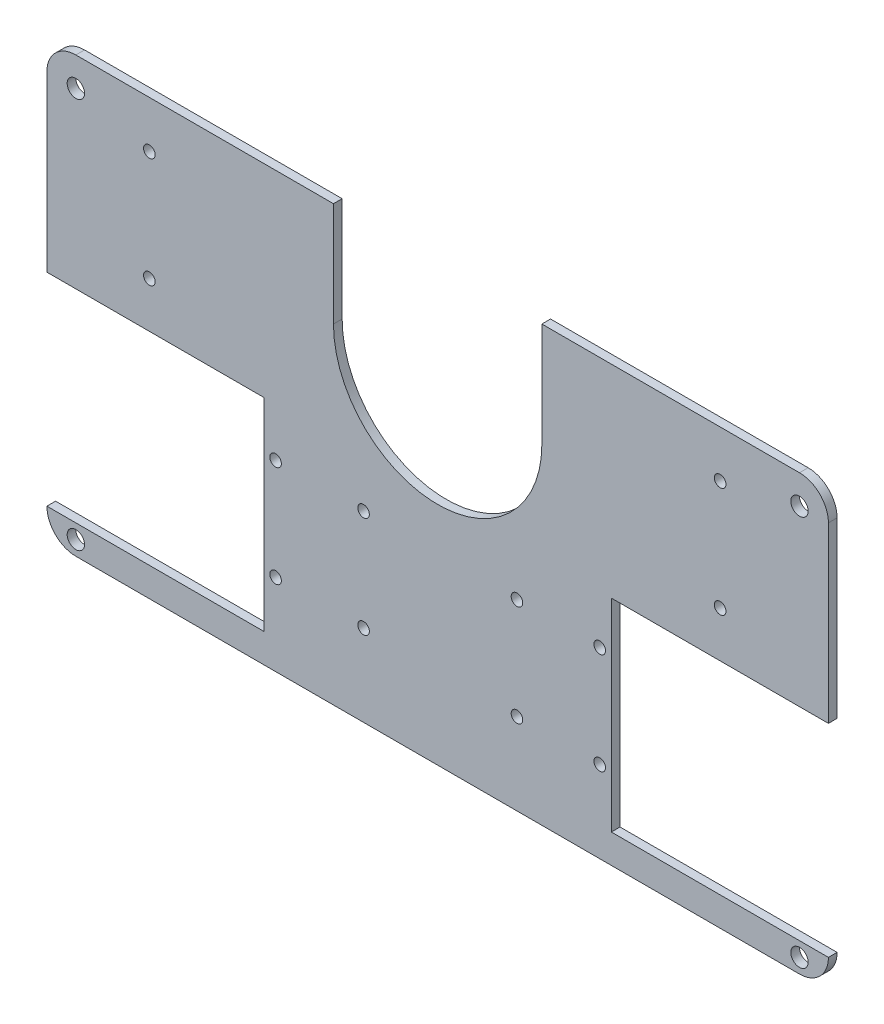
ISO-10303-21;
HEADER;
FILE_DESCRIPTION(('STEP AP214'),'2;1');
FILE_NAME('part.step','',(''),(''),'','','');
FILE_SCHEMA(('AUTOMOTIVE_DESIGN { 1 0 10303 214 1 1 1 1 }'));
ENDSEC;
DATA;
#1=APPLICATION_CONTEXT('core data for automotive mechanical design processes');
#2=APPLICATION_PROTOCOL_DEFINITION('international standard','automotive_design',2000,#1);
#3=PRODUCT_CONTEXT('',#1,'mechanical');
#4=PRODUCT('Part','Part','',(#3));
#5=PRODUCT_RELATED_PRODUCT_CATEGORY('part','',(#4));
#6=PRODUCT_DEFINITION_FORMATION('','',#4);
#7=PRODUCT_DEFINITION_CONTEXT('part definition',#1,'design');
#8=PRODUCT_DEFINITION('design','',#6,#7);
#9=PRODUCT_DEFINITION_SHAPE('','',#8);
#10=(LENGTH_UNIT() NAMED_UNIT(*) SI_UNIT(.MILLI.,.METRE.));
#11=(NAMED_UNIT(*) PLANE_ANGLE_UNIT() SI_UNIT($,.RADIAN.));
#12=(NAMED_UNIT(*) SI_UNIT($,.STERADIAN.) SOLID_ANGLE_UNIT());
#13=UNCERTAINTY_MEASURE_WITH_UNIT(LENGTH_MEASURE(1.E-05),#10,'distance_accuracy_value','');
#14=(GEOMETRIC_REPRESENTATION_CONTEXT(3) GLOBAL_UNCERTAINTY_ASSIGNED_CONTEXT((#13)) GLOBAL_UNIT_ASSIGNED_CONTEXT((#10,
#11,#12)) REPRESENTATION_CONTEXT('',''));
#15=CARTESIAN_POINT('',(0.,0.,0.));
#16=DIRECTION('',(0.,0.,1.));
#17=DIRECTION('',(1.,0.,0.));
#18=AXIS2_PLACEMENT_3D('',#15,#16,#17);
#19=CARTESIAN_POINT('',(260.,-10.,3.));
#20=DIRECTION('',(0.,0.,1.));
#21=DIRECTION('',(1.,0.,0.));
#22=AXIS2_PLACEMENT_3D('',#19,#20,#21);
#23=PLANE('',#22);
#24=CARTESIAN_POINT('',(10.,-145.,3.));
#25=DIRECTION('',(0.,0.,1.));
#26=DIRECTION('',(1.,0.,0.));
#27=AXIS2_PLACEMENT_3D('',#24,#25,#26);
#28=CIRCLE('',#27,3.);
#29=CARTESIAN_POINT('',(13.,-145.,3.));
#30=VERTEX_POINT('',#29);
#31=EDGE_CURVE('E711',#30,#30,#28,.T.);
#32=ORIENTED_EDGE('',*,*,#31,.F.);
#33=EDGE_LOOP('',(#32));
#34=FACE_BOUND('',#33,.T.);
#35=CARTESIAN_POINT('',(260.,-145.,3.));
#36=DIRECTION('',(0.,0.,1.));
#37=DIRECTION('',(1.,0.,0.));
#38=AXIS2_PLACEMENT_3D('',#35,#36,#37);
#39=CIRCLE('',#38,2.99999999999999);
#40=CARTESIAN_POINT('',(263.,-145.,3.));
#41=VERTEX_POINT('',#40);
#42=EDGE_CURVE('E712',#41,#41,#39,.T.);
#43=ORIENTED_EDGE('',*,*,#42,.F.);
#44=EDGE_LOOP('',(#43));
#45=FACE_BOUND('',#44,.T.);
#46=CARTESIAN_POINT('',(260.,-10.,3.));
#47=DIRECTION('',(0.,0.,1.));
#48=DIRECTION('',(1.,0.,0.));
#49=AXIS2_PLACEMENT_3D('',#46,#47,#48);
#50=CIRCLE('',#49,2.99999999999999);
#51=CARTESIAN_POINT('',(263.,-10.,3.));
#52=VERTEX_POINT('',#51);
#53=EDGE_CURVE('E714',#52,#52,#50,.T.);
#54=ORIENTED_EDGE('',*,*,#53,.F.);
#55=EDGE_LOOP('',(#54));
#56=FACE_BOUND('',#55,.T.);
#57=CARTESIAN_POINT('',(10.,-10.,3.));
#58=DIRECTION('',(0.,0.,1.));
#59=DIRECTION('',(1.,0.,0.));
#60=AXIS2_PLACEMENT_3D('',#57,#58,#59);
#61=CIRCLE('',#60,3.);
#62=CARTESIAN_POINT('',(13.,-10.,3.));
#63=VERTEX_POINT('',#62);
#64=EDGE_CURVE('E222',#63,#63,#61,.T.);
#65=ORIENTED_EDGE('',*,*,#64,.F.);
#66=EDGE_LOOP('',(#65));
#67=FACE_BOUND('',#66,.T.);
#68=DIRECTION('',(-1.,0.,0.));
#69=VECTOR('',#68,1.);
#70=CARTESIAN_POINT('',(0.,-70.,3.));
#71=LINE('',#70,#69);
#72=CARTESIAN_POINT('',(75.,-70.,3.));
#73=VERTEX_POINT('',#72);
#74=CARTESIAN_POINT('',(0.,-70.,3.));
#75=VERTEX_POINT('',#74);
#76=EDGE_CURVE('E342',#73,#75,#71,.T.);
#77=ORIENTED_EDGE('',*,*,#76,.F.);
#78=DIRECTION('',(0.,1.,0.));
#79=VECTOR('',#78,1.);
#80=CARTESIAN_POINT('',(75.,-140.,3.));
#81=LINE('',#80,#79);
#82=CARTESIAN_POINT('',(75.,-140.,3.));
#83=VERTEX_POINT('',#82);
#84=EDGE_CURVE('E414',#83,#73,#81,.T.);
#85=ORIENTED_EDGE('',*,*,#84,.F.);
#86=DIRECTION('',(1.,0.,0.));
#87=VECTOR('',#86,1.);
#88=CARTESIAN_POINT('',(0.,-140.,3.));
#89=LINE('',#88,#87);
#90=CARTESIAN_POINT('',(0.,-140.,3.));
#91=VERTEX_POINT('',#90);
#92=EDGE_CURVE('E143',#91,#83,#89,.T.);
#93=ORIENTED_EDGE('',*,*,#92,.F.);
#94=CARTESIAN_POINT('',(10.,-140.,3.));
#95=DIRECTION('',(0.,0.,1.));
#96=DIRECTION('',(1.,0.,0.));
#97=AXIS2_PLACEMENT_3D('',#94,#95,#96);
#98=CIRCLE('',#97,10.);
#99=CARTESIAN_POINT('',(10.0000000000001,-150.,3.));
#100=VERTEX_POINT('',#99);
#101=EDGE_CURVE('E132',#91,#100,#98,.T.);
#102=ORIENTED_EDGE('',*,*,#101,.T.);
#103=DIRECTION('',(1.,0.,0.));
#104=VECTOR('',#103,1.);
#105=CARTESIAN_POINT('',(10.0000000000001,-150.,3.));
#106=LINE('',#105,#104);
#107=CARTESIAN_POINT('',(260.,-150.,3.));
#108=VERTEX_POINT('',#107);
#109=EDGE_CURVE('E138',#100,#108,#106,.T.);
#110=ORIENTED_EDGE('',*,*,#109,.T.);
#111=CARTESIAN_POINT('',(260.,-140.,3.));
#112=DIRECTION('',(0.,0.,1.));
#113=DIRECTION('',(-1.,0.,0.));
#114=AXIS2_PLACEMENT_3D('',#111,#112,#113);
#115=CIRCLE('',#114,10.);
#116=CARTESIAN_POINT('',(270.,-140.,3.));
#117=VERTEX_POINT('',#116);
#118=EDGE_CURVE('E161',#108,#117,#115,.T.);
#119=ORIENTED_EDGE('',*,*,#118,.T.);
#120=DIRECTION('',(1.,0.,0.));
#121=VECTOR('',#120,1.);
#122=CARTESIAN_POINT('',(270.,-140.,3.));
#123=LINE('',#122,#121);
#124=CARTESIAN_POINT('',(195.,-140.,3.));
#125=VERTEX_POINT('',#124);
#126=EDGE_CURVE('E238',#125,#117,#123,.T.);
#127=ORIENTED_EDGE('',*,*,#126,.F.);
#128=DIRECTION('',(0.,-1.,0.));
#129=VECTOR('',#128,1.);
#130=CARTESIAN_POINT('',(195.,-140.,3.));
#131=LINE('',#130,#129);
#132=CARTESIAN_POINT('',(195.,-70.,3.));
#133=VERTEX_POINT('',#132);
#134=EDGE_CURVE('E233',#133,#125,#131,.T.);
#135=ORIENTED_EDGE('',*,*,#134,.F.);
#136=DIRECTION('',(-1.,0.,0.));
#137=VECTOR('',#136,1.);
#138=CARTESIAN_POINT('',(270.,-70.,3.));
#139=LINE('',#138,#137);
#140=CARTESIAN_POINT('',(270.,-70.,3.));
#141=VERTEX_POINT('',#140);
#142=EDGE_CURVE('E229',#141,#133,#139,.T.);
#143=ORIENTED_EDGE('',*,*,#142,.F.);
#144=DIRECTION('',(0.,1.,0.));
#145=VECTOR('',#144,1.);
#146=CARTESIAN_POINT('',(270.,-10.,3.));
#147=LINE('',#146,#145);
#148=CARTESIAN_POINT('',(270.,-10.,3.));
#149=VERTEX_POINT('',#148);
#150=EDGE_CURVE('E59',#141,#149,#147,.T.);
#151=ORIENTED_EDGE('',*,*,#150,.T.);
#152=CARTESIAN_POINT('',(260.,-10.,3.));
#153=DIRECTION('',(0.,0.,1.));
#154=DIRECTION('',(1.,0.,0.));
#155=AXIS2_PLACEMENT_3D('',#152,#153,#154);
#156=CIRCLE('',#155,10.);
#157=CARTESIAN_POINT('',(260.,0.,3.));
#158=VERTEX_POINT('',#157);
#159=EDGE_CURVE('E194',#149,#158,#156,.T.);
#160=ORIENTED_EDGE('',*,*,#159,.T.);
#161=DIRECTION('',(-1.,0.,0.));
#162=VECTOR('',#161,1.);
#163=CARTESIAN_POINT('',(171.,0.,3.));
#164=LINE('',#163,#162);
#165=CARTESIAN_POINT('',(171.,0.,3.));
#166=VERTEX_POINT('',#165);
#167=EDGE_CURVE('E109',#158,#166,#164,.T.);
#168=ORIENTED_EDGE('',*,*,#167,.T.);
#169=DIRECTION('',(0.,-1.,0.));
#170=VECTOR('',#169,1.);
#171=CARTESIAN_POINT('',(171.,-36.,3.));
#172=LINE('',#171,#170);
#173=CARTESIAN_POINT('',(171.,-36.,3.));
#174=VERTEX_POINT('',#173);
#175=EDGE_CURVE('E328',#166,#174,#172,.T.);
#176=ORIENTED_EDGE('',*,*,#175,.T.);
#177=CARTESIAN_POINT('',(135.,-36.,3.));
#178=DIRECTION('',(0.,0.,-1.));
#179=DIRECTION('',(1.,0.,0.));
#180=AXIS2_PLACEMENT_3D('',#177,#178,#179);
#181=CIRCLE('',#180,36.);
#182=CARTESIAN_POINT('',(99.,-36.,3.));
#183=VERTEX_POINT('',#182);
#184=EDGE_CURVE('E330',#174,#183,#181,.T.);
#185=ORIENTED_EDGE('',*,*,#184,.T.);
#186=DIRECTION('',(0.,1.,0.));
#187=VECTOR('',#186,1.);
#188=CARTESIAN_POINT('',(99.,0.,3.));
#189=LINE('',#188,#187);
#190=CARTESIAN_POINT('',(99.,0.,3.));
#191=VERTEX_POINT('',#190);
#192=EDGE_CURVE('E332',#183,#191,#189,.T.);
#193=ORIENTED_EDGE('',*,*,#192,.T.);
#194=DIRECTION('',(-1.,0.,0.));
#195=VECTOR('',#194,1.);
#196=CARTESIAN_POINT('',(10.0000000000001,0.,3.));
#197=LINE('',#196,#195);
#198=CARTESIAN_POINT('',(10.0000000000001,0.,3.));
#199=VERTEX_POINT('',#198);
#200=EDGE_CURVE('E334',#191,#199,#197,.T.);
#201=ORIENTED_EDGE('',*,*,#200,.T.);
#202=CARTESIAN_POINT('',(10.,-10.,3.));
#203=DIRECTION('',(0.,0.,1.));
#204=DIRECTION('',(-1.,0.,0.));
#205=AXIS2_PLACEMENT_3D('',#202,#203,#204);
#206=CIRCLE('',#205,10.);
#207=CARTESIAN_POINT('',(0.,-10.,3.));
#208=VERTEX_POINT('',#207);
#209=EDGE_CURVE('E336',#199,#208,#206,.T.);
#210=ORIENTED_EDGE('',*,*,#209,.T.);
#211=DIRECTION('',(0.,-1.,0.));
#212=VECTOR('',#211,1.);
#213=CARTESIAN_POINT('',(0.,-10.,3.));
#214=LINE('',#213,#212);
#215=EDGE_CURVE('E146',#208,#75,#214,.T.);
#216=ORIENTED_EDGE('',*,*,#215,.T.);
#217=EDGE_LOOP('',(#77,#85,#93,#102,#110,#119,#127,#135,#143,#151,#160,#168,#176,#185,#193,#201,
#210,#216));
#218=FACE_BOUND('',#217,.T.);
#219=CARTESIAN_POINT('',(232.599999999998,-16.1912387838236,3.));
#220=DIRECTION('',(0.,0.,1.));
#221=DIRECTION('',(1.,0.,0.));
#222=AXIS2_PLACEMENT_3D('',#219,#220,#221);
#223=CIRCLE('',#222,2.);
#224=CARTESIAN_POINT('',(234.599999999998,-16.1912387838236,3.));
#225=VERTEX_POINT('',#224);
#226=EDGE_CURVE('E262',#225,#225,#223,.T.);
#227=ORIENTED_EDGE('',*,*,#226,.F.);
#228=EDGE_LOOP('',(#227));
#229=FACE_BOUND('',#228,.T.);
#230=CARTESIAN_POINT('',(35.399999999965,-16.1912387838434,3.));
#231=DIRECTION('',(0.,0.,1.));
#232=DIRECTION('',(1.,0.,0.));
#233=AXIS2_PLACEMENT_3D('',#230,#231,#232);
#234=CIRCLE('',#233,2.);
#235=CARTESIAN_POINT('',(37.399999999965,-16.1912387838434,3.));
#236=VERTEX_POINT('',#235);
#237=EDGE_CURVE('E274',#236,#236,#234,.T.);
#238=ORIENTED_EDGE('',*,*,#237,.F.);
#239=EDGE_LOOP('',(#238));
#240=FACE_BOUND('',#239,.T.);
#241=CARTESIAN_POINT('',(191.,-121.78942978766,3.));
#242=DIRECTION('',(0.,0.,1.));
#243=DIRECTION('',(1.,0.,0.));
#244=AXIS2_PLACEMENT_3D('',#241,#242,#243);
#245=CIRCLE('',#244,2.);
#246=CARTESIAN_POINT('',(193.,-121.78942978766,3.));
#247=VERTEX_POINT('',#246);
#248=EDGE_CURVE('E286',#247,#247,#245,.T.);
#249=ORIENTED_EDGE('',*,*,#248,.F.);
#250=EDGE_LOOP('',(#249));
#251=FACE_BOUND('',#250,.T.);
#252=CARTESIAN_POINT('',(162.400000000007,-121.78942978766,3.));
#253=DIRECTION('',(0.,0.,1.));
#254=DIRECTION('',(1.,0.,0.));
#255=AXIS2_PLACEMENT_3D('',#252,#253,#254);
#256=CIRCLE('',#255,2.);
#257=CARTESIAN_POINT('',(164.400000000007,-121.78942978766,3.));
#258=VERTEX_POINT('',#257);
#259=EDGE_CURVE('E298',#258,#258,#256,.T.);
#260=ORIENTED_EDGE('',*,*,#259,.F.);
#261=EDGE_LOOP('',(#260));
#262=FACE_BOUND('',#261,.T.);
#263=CARTESIAN_POINT('',(79.,-121.78942978766,3.));
#264=DIRECTION('',(0.,0.,1.));
#265=DIRECTION('',(1.,0.,0.));
#266=AXIS2_PLACEMENT_3D('',#263,#264,#265);
#267=CIRCLE('',#266,2.);
#268=CARTESIAN_POINT('',(81.,-121.78942978766,3.));
#269=VERTEX_POINT('',#268);
#270=EDGE_CURVE('E310',#269,#269,#267,.T.);
#271=ORIENTED_EDGE('',*,*,#270,.F.);
#272=EDGE_LOOP('',(#271));
#273=FACE_BOUND('',#272,.T.);
#274=CARTESIAN_POINT('',(109.4,-121.78942978766,3.));
#275=DIRECTION('',(0.,0.,1.));
#276=DIRECTION('',(1.,0.,0.));
#277=AXIS2_PLACEMENT_3D('',#274,#275,#276);
#278=CIRCLE('',#277,2.);
#279=CARTESIAN_POINT('',(111.4,-121.78942978766,3.));
#280=VERTEX_POINT('',#279);
#281=EDGE_CURVE('E172',#280,#280,#278,.T.);
#282=ORIENTED_EDGE('',*,*,#281,.F.);
#283=EDGE_LOOP('',(#282));
#284=FACE_BOUND('',#283,.T.);
#285=CARTESIAN_POINT('',(109.4,-86.7894297876602,3.));
#286=DIRECTION('',(0.,0.,1.));
#287=DIRECTION('',(1.,0.,0.));
#288=AXIS2_PLACEMENT_3D('',#285,#286,#287);
#289=CIRCLE('',#288,2.);
#290=CARTESIAN_POINT('',(111.4,-86.7894297876602,3.));
#291=VERTEX_POINT('',#290);
#292=EDGE_CURVE('E316',#291,#291,#289,.T.);
#293=ORIENTED_EDGE('',*,*,#292,.F.);
#294=EDGE_LOOP('',(#293));
#295=FACE_BOUND('',#294,.T.);
#296=CARTESIAN_POINT('',(79.,-86.7894297876602,3.));
#297=DIRECTION('',(0.,0.,1.));
#298=DIRECTION('',(1.,0.,0.));
#299=AXIS2_PLACEMENT_3D('',#296,#297,#298);
#300=CIRCLE('',#299,2.);
#301=CARTESIAN_POINT('',(81.,-86.7894297876602,3.));
#302=VERTEX_POINT('',#301);
#303=EDGE_CURVE('E304',#302,#302,#300,.T.);
#304=ORIENTED_EDGE('',*,*,#303,.F.);
#305=EDGE_LOOP('',(#304));
#306=FACE_BOUND('',#305,.T.);
#307=CARTESIAN_POINT('',(162.400000000007,-86.7894297876602,3.));
#308=DIRECTION('',(0.,0.,1.));
#309=DIRECTION('',(1.,0.,0.));
#310=AXIS2_PLACEMENT_3D('',#307,#308,#309);
#311=CIRCLE('',#310,2.);
#312=CARTESIAN_POINT('',(164.400000000007,-86.7894297876602,3.));
#313=VERTEX_POINT('',#312);
#314=EDGE_CURVE('E292',#313,#313,#311,.T.);
#315=ORIENTED_EDGE('',*,*,#314,.F.);
#316=EDGE_LOOP('',(#315));
#317=FACE_BOUND('',#316,.T.);
#318=CARTESIAN_POINT('',(191.,-86.7894297876602,3.));
#319=DIRECTION('',(0.,0.,1.));
#320=DIRECTION('',(1.,0.,0.));
#321=AXIS2_PLACEMENT_3D('',#318,#319,#320);
#322=CIRCLE('',#321,2.);
#323=CARTESIAN_POINT('',(193.,-86.7894297876602,3.));
#324=VERTEX_POINT('',#323);
#325=EDGE_CURVE('E280',#324,#324,#322,.T.);
#326=ORIENTED_EDGE('',*,*,#325,.F.);
#327=EDGE_LOOP('',(#326));
#328=FACE_BOUND('',#327,.T.);
#329=CARTESIAN_POINT('',(35.399999999965,-54.1912387838434,3.));
#330=DIRECTION('',(0.,0.,1.));
#331=DIRECTION('',(1.,0.,0.));
#332=AXIS2_PLACEMENT_3D('',#329,#330,#331);
#333=CIRCLE('',#332,2.);
#334=CARTESIAN_POINT('',(37.399999999965,-54.1912387838434,3.));
#335=VERTEX_POINT('',#334);
#336=EDGE_CURVE('E268',#335,#335,#333,.T.);
#337=ORIENTED_EDGE('',*,*,#336,.F.);
#338=EDGE_LOOP('',(#337));
#339=FACE_BOUND('',#338,.T.);
#340=CARTESIAN_POINT('',(232.599999999998,-54.1912387838236,3.));
#341=DIRECTION('',(0.,0.,1.));
#342=DIRECTION('',(1.,0.,0.));
#343=AXIS2_PLACEMENT_3D('',#340,#341,#342);
#344=CIRCLE('',#343,2.);
#345=CARTESIAN_POINT('',(234.599999999998,-54.1912387838236,3.));
#346=VERTEX_POINT('',#345);
#347=EDGE_CURVE('E254',#346,#346,#344,.T.);
#348=ORIENTED_EDGE('',*,*,#347,.F.);
#349=EDGE_LOOP('',(#348));
#350=FACE_BOUND('',#349,.T.);
#351=ADVANCED_FACE('F33',(#34,#45,#56,#67,#218,#229,#240,#251,#262,#273,#284,#295,#306,#317,
#328,#339,#350),#23,.T.);
#352=CARTESIAN_POINT('',(260.,-10.,0.));
#353=DIRECTION('',(0.,0.,1.));
#354=DIRECTION('',(1.,0.,0.));
#355=AXIS2_PLACEMENT_3D('',#352,#353,#354);
#356=PLANE('',#355);
#357=CARTESIAN_POINT('',(10.,-145.,0.));
#358=DIRECTION('',(0.,0.,1.));
#359=DIRECTION('',(1.,0.,0.));
#360=AXIS2_PLACEMENT_3D('',#357,#358,#359);
#361=CIRCLE('',#360,3.);
#362=CARTESIAN_POINT('',(13.,-145.,0.));
#363=VERTEX_POINT('',#362);
#364=EDGE_CURVE('E37',#363,#363,#361,.T.);
#365=ORIENTED_EDGE('',*,*,#364,.T.);
#366=EDGE_LOOP('',(#365));
#367=FACE_BOUND('',#366,.T.);
#368=CARTESIAN_POINT('',(260.,-145.,0.));
#369=DIRECTION('',(0.,0.,1.));
#370=DIRECTION('',(1.,0.,0.));
#371=AXIS2_PLACEMENT_3D('',#368,#369,#370);
#372=CIRCLE('',#371,2.99999999999999);
#373=CARTESIAN_POINT('',(263.,-145.,0.));
#374=VERTEX_POINT('',#373);
#375=EDGE_CURVE('E224',#374,#374,#372,.T.);
#376=ORIENTED_EDGE('',*,*,#375,.T.);
#377=EDGE_LOOP('',(#376));
#378=FACE_BOUND('',#377,.T.);
#379=CARTESIAN_POINT('',(260.,-10.,0.));
#380=DIRECTION('',(0.,0.,1.));
#381=DIRECTION('',(1.,0.,0.));
#382=AXIS2_PLACEMENT_3D('',#379,#380,#381);
#383=CIRCLE('',#382,2.99999999999999);
#384=CARTESIAN_POINT('',(263.,-10.,0.));
#385=VERTEX_POINT('',#384);
#386=EDGE_CURVE('E221',#385,#385,#383,.T.);
#387=ORIENTED_EDGE('',*,*,#386,.T.);
#388=EDGE_LOOP('',(#387));
#389=FACE_BOUND('',#388,.T.);
#390=CARTESIAN_POINT('',(10.,-10.,0.));
#391=DIRECTION('',(0.,0.,1.));
#392=DIRECTION('',(1.,0.,0.));
#393=AXIS2_PLACEMENT_3D('',#390,#391,#392);
#394=CIRCLE('',#393,3.);
#395=CARTESIAN_POINT('',(13.,-10.,0.));
#396=VERTEX_POINT('',#395);
#397=EDGE_CURVE('E218',#396,#396,#394,.T.);
#398=ORIENTED_EDGE('',*,*,#397,.T.);
#399=EDGE_LOOP('',(#398));
#400=FACE_BOUND('',#399,.T.);
#401=DIRECTION('',(0.,1.,0.));
#402=VECTOR('',#401,1.);
#403=CARTESIAN_POINT('',(75.,-140.,0.));
#404=LINE('',#403,#402);
#405=CARTESIAN_POINT('',(75.,-140.,0.));
#406=VERTEX_POINT('',#405);
#407=CARTESIAN_POINT('',(75.,-70.,0.));
#408=VERTEX_POINT('',#407);
#409=EDGE_CURVE('E410',#406,#408,#404,.T.);
#410=ORIENTED_EDGE('',*,*,#409,.T.);
#411=DIRECTION('',(-1.,0.,0.));
#412=VECTOR('',#411,1.);
#413=CARTESIAN_POINT('',(0.,-70.,0.));
#414=LINE('',#413,#412);
#415=CARTESIAN_POINT('',(0.,-70.,0.));
#416=VERTEX_POINT('',#415);
#417=EDGE_CURVE('E365',#408,#416,#414,.T.);
#418=ORIENTED_EDGE('',*,*,#417,.T.);
#419=DIRECTION('',(0.,-1.,0.));
#420=VECTOR('',#419,1.);
#421=CARTESIAN_POINT('',(0.,-10.,0.));
#422=LINE('',#421,#420);
#423=CARTESIAN_POINT('',(0.,-10.,0.));
#424=VERTEX_POINT('',#423);
#425=EDGE_CURVE('E184',#424,#416,#422,.T.);
#426=ORIENTED_EDGE('',*,*,#425,.F.);
#427=CARTESIAN_POINT('',(10.,-10.,0.));
#428=DIRECTION('',(0.,0.,1.));
#429=DIRECTION('',(-1.,0.,0.));
#430=AXIS2_PLACEMENT_3D('',#427,#428,#429);
#431=CIRCLE('',#430,10.);
#432=CARTESIAN_POINT('',(10.0000000000001,0.,0.));
#433=VERTEX_POINT('',#432);
#434=EDGE_CURVE('E182',#433,#424,#431,.T.);
#435=ORIENTED_EDGE('',*,*,#434,.F.);
#436=DIRECTION('',(-1.,0.,0.));
#437=VECTOR('',#436,1.);
#438=CARTESIAN_POINT('',(10.0000000000001,0.,0.));
#439=LINE('',#438,#437);
#440=CARTESIAN_POINT('',(99.,0.,0.));
#441=VERTEX_POINT('',#440);
#442=EDGE_CURVE('E180',#441,#433,#439,.T.);
#443=ORIENTED_EDGE('',*,*,#442,.F.);
#444=DIRECTION('',(0.,1.,0.));
#445=VECTOR('',#444,1.);
#446=CARTESIAN_POINT('',(99.,0.,0.));
#447=LINE('',#446,#445);
#448=CARTESIAN_POINT('',(99.,-36.,0.));
#449=VERTEX_POINT('',#448);
#450=EDGE_CURVE('E178',#449,#441,#447,.T.);
#451=ORIENTED_EDGE('',*,*,#450,.F.);
#452=CARTESIAN_POINT('',(135.,-36.,0.));
#453=DIRECTION('',(0.,0.,-1.));
#454=DIRECTION('',(1.,0.,0.));
#455=AXIS2_PLACEMENT_3D('',#452,#453,#454);
#456=CIRCLE('',#455,36.);
#457=CARTESIAN_POINT('',(171.,-36.,0.));
#458=VERTEX_POINT('',#457);
#459=EDGE_CURVE('E176',#458,#449,#456,.T.);
#460=ORIENTED_EDGE('',*,*,#459,.F.);
#461=DIRECTION('',(0.,-1.,0.));
#462=VECTOR('',#461,1.);
#463=CARTESIAN_POINT('',(171.,-36.,0.));
#464=LINE('',#463,#462);
#465=CARTESIAN_POINT('',(171.,0.,0.));
#466=VERTEX_POINT('',#465);
#467=EDGE_CURVE('E174',#466,#458,#464,.T.);
#468=ORIENTED_EDGE('',*,*,#467,.F.);
#469=DIRECTION('',(-1.,0.,0.));
#470=VECTOR('',#469,1.);
#471=CARTESIAN_POINT('',(171.,0.,0.));
#472=LINE('',#471,#470);
#473=CARTESIAN_POINT('',(260.,0.,0.));
#474=VERTEX_POINT('',#473);
#475=EDGE_CURVE('E171',#474,#466,#472,.T.);
#476=ORIENTED_EDGE('',*,*,#475,.F.);
#477=CARTESIAN_POINT('',(260.,-10.,0.));
#478=DIRECTION('',(0.,0.,1.));
#479=DIRECTION('',(1.,0.,0.));
#480=AXIS2_PLACEMENT_3D('',#477,#478,#479);
#481=CIRCLE('',#480,10.);
#482=CARTESIAN_POINT('',(270.,-10.,0.));
#483=VERTEX_POINT('',#482);
#484=EDGE_CURVE('E168',#483,#474,#481,.T.);
#485=ORIENTED_EDGE('',*,*,#484,.F.);
#486=DIRECTION('',(0.,1.,0.));
#487=VECTOR('',#486,1.);
#488=CARTESIAN_POINT('',(270.,-10.,0.));
#489=LINE('',#488,#487);
#490=CARTESIAN_POINT('',(270.,-70.,0.));
#491=VERTEX_POINT('',#490);
#492=EDGE_CURVE('E101',#491,#483,#489,.T.);
#493=ORIENTED_EDGE('',*,*,#492,.F.);
#494=DIRECTION('',(-1.,0.,0.));
#495=VECTOR('',#494,1.);
#496=CARTESIAN_POINT('',(270.,-70.,0.));
#497=LINE('',#496,#495);
#498=CARTESIAN_POINT('',(195.,-70.,0.));
#499=VERTEX_POINT('',#498);
#500=EDGE_CURVE('E50',#491,#499,#497,.T.);
#501=ORIENTED_EDGE('',*,*,#500,.T.);
#502=DIRECTION('',(0.,-1.,0.));
#503=VECTOR('',#502,1.);
#504=CARTESIAN_POINT('',(195.,-140.,0.));
#505=LINE('',#504,#503);
#506=CARTESIAN_POINT('',(195.,-140.,0.));
#507=VERTEX_POINT('',#506);
#508=EDGE_CURVE('E366',#499,#507,#505,.T.);
#509=ORIENTED_EDGE('',*,*,#508,.T.);
#510=DIRECTION('',(1.,0.,0.));
#511=VECTOR('',#510,1.);
#512=CARTESIAN_POINT('',(270.,-140.,0.));
#513=LINE('',#512,#511);
#514=CARTESIAN_POINT('',(270.,-140.,0.));
#515=VERTEX_POINT('',#514);
#516=EDGE_CURVE('E241',#507,#515,#513,.T.);
#517=ORIENTED_EDGE('',*,*,#516,.T.);
#518=CARTESIAN_POINT('',(260.,-140.,0.));
#519=DIRECTION('',(0.,0.,1.));
#520=DIRECTION('',(-1.,0.,0.));
#521=AXIS2_PLACEMENT_3D('',#518,#519,#520);
#522=CIRCLE('',#521,10.);
#523=CARTESIAN_POINT('',(260.,-150.,0.));
#524=VERTEX_POINT('',#523);
#525=EDGE_CURVE('E190',#524,#515,#522,.T.);
#526=ORIENTED_EDGE('',*,*,#525,.F.);
#527=DIRECTION('',(1.,0.,0.));
#528=VECTOR('',#527,1.);
#529=CARTESIAN_POINT('',(10.0000000000001,-150.,0.));
#530=LINE('',#529,#528);
#531=CARTESIAN_POINT('',(10.0000000000001,-150.,0.));
#532=VERTEX_POINT('',#531);
#533=EDGE_CURVE('E188',#532,#524,#530,.T.);
#534=ORIENTED_EDGE('',*,*,#533,.F.);
#535=CARTESIAN_POINT('',(10.,-140.,0.));
#536=DIRECTION('',(0.,0.,1.));
#537=DIRECTION('',(1.,0.,0.));
#538=AXIS2_PLACEMENT_3D('',#535,#536,#537);
#539=CIRCLE('',#538,10.);
#540=CARTESIAN_POINT('',(0.,-140.,0.));
#541=VERTEX_POINT('',#540);
#542=EDGE_CURVE('E152',#541,#532,#539,.T.);
#543=ORIENTED_EDGE('',*,*,#542,.F.);
#544=DIRECTION('',(1.,0.,0.));
#545=VECTOR('',#544,1.);
#546=CARTESIAN_POINT('',(0.,-140.,0.));
#547=LINE('',#546,#545);
#548=EDGE_CURVE('E407',#541,#406,#547,.T.);
#549=ORIENTED_EDGE('',*,*,#548,.T.);
#550=EDGE_LOOP('',(#410,#418,#426,#435,#443,#451,#460,#468,#476,#485,#493,#501,#509,#517,#526,
#534,#543,#549));
#551=FACE_BOUND('',#550,.T.);
#552=CARTESIAN_POINT('',(109.4,-121.78942978766,0.));
#553=DIRECTION('',(0.,0.,1.));
#554=DIRECTION('',(1.,0.,0.));
#555=AXIS2_PLACEMENT_3D('',#552,#553,#554);
#556=CIRCLE('',#555,2.);
#557=CARTESIAN_POINT('',(111.4,-121.78942978766,0.));
#558=VERTEX_POINT('',#557);
#559=EDGE_CURVE('E319',#558,#558,#556,.T.);
#560=ORIENTED_EDGE('',*,*,#559,.T.);
#561=EDGE_LOOP('',(#560));
#562=FACE_BOUND('',#561,.T.);
#563=CARTESIAN_POINT('',(109.4,-86.7894297876602,0.));
#564=DIRECTION('',(0.,0.,1.));
#565=DIRECTION('',(1.,0.,0.));
#566=AXIS2_PLACEMENT_3D('',#563,#564,#565);
#567=CIRCLE('',#566,2.);
#568=CARTESIAN_POINT('',(111.4,-86.7894297876602,0.));
#569=VERTEX_POINT('',#568);
#570=EDGE_CURVE('E313',#569,#569,#567,.T.);
#571=ORIENTED_EDGE('',*,*,#570,.T.);
#572=EDGE_LOOP('',(#571));
#573=FACE_BOUND('',#572,.T.);
#574=CARTESIAN_POINT('',(79.,-121.78942978766,0.));
#575=DIRECTION('',(0.,0.,1.));
#576=DIRECTION('',(1.,0.,0.));
#577=AXIS2_PLACEMENT_3D('',#574,#575,#576);
#578=CIRCLE('',#577,2.);
#579=CARTESIAN_POINT('',(81.,-121.78942978766,0.));
#580=VERTEX_POINT('',#579);
#581=EDGE_CURVE('E307',#580,#580,#578,.T.);
#582=ORIENTED_EDGE('',*,*,#581,.T.);
#583=EDGE_LOOP('',(#582));
#584=FACE_BOUND('',#583,.T.);
#585=CARTESIAN_POINT('',(79.,-86.7894297876602,0.));
#586=DIRECTION('',(0.,0.,1.));
#587=DIRECTION('',(1.,0.,0.));
#588=AXIS2_PLACEMENT_3D('',#585,#586,#587);
#589=CIRCLE('',#588,2.);
#590=CARTESIAN_POINT('',(81.,-86.7894297876602,0.));
#591=VERTEX_POINT('',#590);
#592=EDGE_CURVE('E301',#591,#591,#589,.T.);
#593=ORIENTED_EDGE('',*,*,#592,.T.);
#594=EDGE_LOOP('',(#593));
#595=FACE_BOUND('',#594,.T.);
#596=CARTESIAN_POINT('',(162.400000000007,-121.78942978766,0.));
#597=DIRECTION('',(0.,0.,1.));
#598=DIRECTION('',(1.,0.,0.));
#599=AXIS2_PLACEMENT_3D('',#596,#597,#598);
#600=CIRCLE('',#599,2.);
#601=CARTESIAN_POINT('',(164.400000000007,-121.78942978766,0.));
#602=VERTEX_POINT('',#601);
#603=EDGE_CURVE('E295',#602,#602,#600,.T.);
#604=ORIENTED_EDGE('',*,*,#603,.T.);
#605=EDGE_LOOP('',(#604));
#606=FACE_BOUND('',#605,.T.);
#607=CARTESIAN_POINT('',(162.400000000007,-86.7894297876602,0.));
#608=DIRECTION('',(0.,0.,1.));
#609=DIRECTION('',(1.,0.,0.));
#610=AXIS2_PLACEMENT_3D('',#607,#608,#609);
#611=CIRCLE('',#610,2.);
#612=CARTESIAN_POINT('',(164.400000000007,-86.7894297876602,0.));
#613=VERTEX_POINT('',#612);
#614=EDGE_CURVE('E289',#613,#613,#611,.T.);
#615=ORIENTED_EDGE('',*,*,#614,.T.);
#616=EDGE_LOOP('',(#615));
#617=FACE_BOUND('',#616,.T.);
#618=CARTESIAN_POINT('',(191.,-121.78942978766,0.));
#619=DIRECTION('',(0.,0.,1.));
#620=DIRECTION('',(1.,0.,0.));
#621=AXIS2_PLACEMENT_3D('',#618,#619,#620);
#622=CIRCLE('',#621,2.);
#623=CARTESIAN_POINT('',(193.,-121.78942978766,0.));
#624=VERTEX_POINT('',#623);
#625=EDGE_CURVE('E283',#624,#624,#622,.T.);
#626=ORIENTED_EDGE('',*,*,#625,.T.);
#627=EDGE_LOOP('',(#626));
#628=FACE_BOUND('',#627,.T.);
#629=CARTESIAN_POINT('',(191.,-86.7894297876602,0.));
#630=DIRECTION('',(0.,0.,1.));
#631=DIRECTION('',(1.,0.,0.));
#632=AXIS2_PLACEMENT_3D('',#629,#630,#631);
#633=CIRCLE('',#632,2.);
#634=CARTESIAN_POINT('',(193.,-86.7894297876602,0.));
#635=VERTEX_POINT('',#634);
#636=EDGE_CURVE('E277',#635,#635,#633,.T.);
#637=ORIENTED_EDGE('',*,*,#636,.T.);
#638=EDGE_LOOP('',(#637));
#639=FACE_BOUND('',#638,.T.);
#640=CARTESIAN_POINT('',(35.399999999965,-16.1912387838434,0.));
#641=DIRECTION('',(0.,0.,1.));
#642=DIRECTION('',(1.,0.,0.));
#643=AXIS2_PLACEMENT_3D('',#640,#641,#642);
#644=CIRCLE('',#643,2.);
#645=CARTESIAN_POINT('',(37.399999999965,-16.1912387838434,0.));
#646=VERTEX_POINT('',#645);
#647=EDGE_CURVE('E271',#646,#646,#644,.T.);
#648=ORIENTED_EDGE('',*,*,#647,.T.);
#649=EDGE_LOOP('',(#648));
#650=FACE_BOUND('',#649,.T.);
#651=CARTESIAN_POINT('',(35.399999999965,-54.1912387838434,0.));
#652=DIRECTION('',(0.,0.,1.));
#653=DIRECTION('',(1.,0.,0.));
#654=AXIS2_PLACEMENT_3D('',#651,#652,#653);
#655=CIRCLE('',#654,2.);
#656=CARTESIAN_POINT('',(37.399999999965,-54.1912387838434,0.));
#657=VERTEX_POINT('',#656);
#658=EDGE_CURVE('E265',#657,#657,#655,.T.);
#659=ORIENTED_EDGE('',*,*,#658,.T.);
#660=EDGE_LOOP('',(#659));
#661=FACE_BOUND('',#660,.T.);
#662=CARTESIAN_POINT('',(232.599999999998,-16.1912387838236,0.));
#663=DIRECTION('',(0.,0.,1.));
#664=DIRECTION('',(1.,0.,0.));
#665=AXIS2_PLACEMENT_3D('',#662,#663,#664);
#666=CIRCLE('',#665,2.);
#667=CARTESIAN_POINT('',(234.599999999998,-16.1912387838236,0.));
#668=VERTEX_POINT('',#667);
#669=EDGE_CURVE('E257',#668,#668,#666,.T.);
#670=ORIENTED_EDGE('',*,*,#669,.T.);
#671=EDGE_LOOP('',(#670));
#672=FACE_BOUND('',#671,.T.);
#673=CARTESIAN_POINT('',(232.599999999998,-54.1912387838236,0.));
#674=DIRECTION('',(0.,0.,1.));
#675=DIRECTION('',(1.,0.,0.));
#676=AXIS2_PLACEMENT_3D('',#673,#674,#675);
#677=CIRCLE('',#676,2.);
#678=CARTESIAN_POINT('',(234.599999999998,-54.1912387838236,0.));
#679=VERTEX_POINT('',#678);
#680=EDGE_CURVE('E258',#679,#679,#677,.T.);
#681=ORIENTED_EDGE('',*,*,#680,.T.);
#682=EDGE_LOOP('',(#681));
#683=FACE_BOUND('',#682,.T.);
#684=ADVANCED_FACE('F376',(#367,#378,#389,#400,#551,#562,#573,#584,#595,#606,#617,#628,#639,
#650,#661,#672,#683),#356,.F.);
#685=CARTESIAN_POINT('',(260.,-10.,3.));
#686=DIRECTION('',(0.,0.,-1.));
#687=DIRECTION('',(-1.,0.,0.));
#688=AXIS2_PLACEMENT_3D('',#685,#686,#687);
#689=CYLINDRICAL_SURFACE('',#688,10.);
#690=ORIENTED_EDGE('',*,*,#484,.T.);
#691=DIRECTION('',(0.,0.,-1.));
#692=VECTOR('',#691,1.);
#693=CARTESIAN_POINT('',(260.,0.,3.));
#694=LINE('',#693,#692);
#695=EDGE_CURVE('E11',#158,#474,#694,.T.);
#696=ORIENTED_EDGE('',*,*,#695,.F.);
#697=ORIENTED_EDGE('',*,*,#159,.F.);
#698=DIRECTION('',(0.,0.,-1.));
#699=VECTOR('',#698,1.);
#700=CARTESIAN_POINT('',(270.,-10.,3.));
#701=LINE('',#700,#699);
#702=EDGE_CURVE('E167',#149,#483,#701,.T.);
#703=ORIENTED_EDGE('',*,*,#702,.T.);
#704=EDGE_LOOP('',(#690,#696,#697,#703));
#705=FACE_BOUND('',#704,.T.);
#706=ADVANCED_FACE('F35',(#705),#689,.T.);
#707=CARTESIAN_POINT('',(171.,0.,3.));
#708=DIRECTION('',(0.,-1.,0.));
#709=DIRECTION('',(0.,0.,-1.));
#710=AXIS2_PLACEMENT_3D('',#707,#708,#709);
#711=PLANE('',#710);
#712=ORIENTED_EDGE('',*,*,#475,.T.);
#713=DIRECTION('',(0.,0.,-1.));
#714=VECTOR('',#713,1.);
#715=CARTESIAN_POINT('',(171.,0.,3.));
#716=LINE('',#715,#714);
#717=EDGE_CURVE('E42',#166,#466,#716,.T.);
#718=ORIENTED_EDGE('',*,*,#717,.F.);
#719=ORIENTED_EDGE('',*,*,#167,.F.);
#720=ORIENTED_EDGE('',*,*,#695,.T.);
#721=EDGE_LOOP('',(#712,#718,#719,#720));
#722=FACE_BOUND('',#721,.T.);
#723=ADVANCED_FACE('F474',(#722),#711,.F.);
#724=CARTESIAN_POINT('',(171.,-36.,3.));
#725=DIRECTION('',(1.,0.,0.));
#726=DIRECTION('',(0.,0.,-1.));
#727=AXIS2_PLACEMENT_3D('',#724,#725,#726);
#728=PLANE('',#727);
#729=ORIENTED_EDGE('',*,*,#467,.T.);
#730=DIRECTION('',(0.,0.,-1.));
#731=VECTOR('',#730,1.);
#732=CARTESIAN_POINT('',(171.,-36.,3.));
#733=LINE('',#732,#731);
#734=EDGE_CURVE('E213',#174,#458,#733,.T.);
#735=ORIENTED_EDGE('',*,*,#734,.F.);
#736=ORIENTED_EDGE('',*,*,#175,.F.);
#737=ORIENTED_EDGE('',*,*,#717,.T.);
#738=EDGE_LOOP('',(#729,#735,#736,#737));
#739=FACE_BOUND('',#738,.T.);
#740=ADVANCED_FACE('F471',(#739),#728,.F.);
#741=CARTESIAN_POINT('',(135.,-36.,3.));
#742=DIRECTION('',(0.,0.,-1.));
#743=DIRECTION('',(-1.,0.,0.));
#744=AXIS2_PLACEMENT_3D('',#741,#742,#743);
#745=CYLINDRICAL_SURFACE('',#744,36.);
#746=ORIENTED_EDGE('',*,*,#459,.T.);
#747=DIRECTION('',(0.,0.,-1.));
#748=VECTOR('',#747,1.);
#749=CARTESIAN_POINT('',(99.,-36.,3.));
#750=LINE('',#749,#748);
#751=EDGE_CURVE('E210',#183,#449,#750,.T.);
#752=ORIENTED_EDGE('',*,*,#751,.F.);
#753=ORIENTED_EDGE('',*,*,#184,.F.);
#754=ORIENTED_EDGE('',*,*,#734,.T.);
#755=EDGE_LOOP('',(#746,#752,#753,#754));
#756=FACE_BOUND('',#755,.T.);
#757=ADVANCED_FACE('F467',(#756),#745,.F.);
#758=CARTESIAN_POINT('',(99.,0.,3.));
#759=DIRECTION('',(-1.,0.,0.));
#760=DIRECTION('',(0.,0.,1.));
#761=AXIS2_PLACEMENT_3D('',#758,#759,#760);
#762=PLANE('',#761);
#763=ORIENTED_EDGE('',*,*,#450,.T.);
#764=DIRECTION('',(0.,0.,-1.));
#765=VECTOR('',#764,1.);
#766=CARTESIAN_POINT('',(99.,0.,3.));
#767=LINE('',#766,#765);
#768=EDGE_CURVE('E207',#191,#441,#767,.T.);
#769=ORIENTED_EDGE('',*,*,#768,.F.);
#770=ORIENTED_EDGE('',*,*,#192,.F.);
#771=ORIENTED_EDGE('',*,*,#751,.T.);
#772=EDGE_LOOP('',(#763,#769,#770,#771));
#773=FACE_BOUND('',#772,.T.);
#774=ADVANCED_FACE('F463',(#773),#762,.F.);
#775=CARTESIAN_POINT('',(10.0000000000001,0.,3.));
#776=DIRECTION('',(0.,-1.,0.));
#777=DIRECTION('',(0.,0.,-1.));
#778=AXIS2_PLACEMENT_3D('',#775,#776,#777);
#779=PLANE('',#778);
#780=ORIENTED_EDGE('',*,*,#442,.T.);
#781=DIRECTION('',(0.,0.,-1.));
#782=VECTOR('',#781,1.);
#783=CARTESIAN_POINT('',(10.0000000000001,0.,3.));
#784=LINE('',#783,#782);
#785=EDGE_CURVE('E204',#199,#433,#784,.T.);
#786=ORIENTED_EDGE('',*,*,#785,.F.);
#787=ORIENTED_EDGE('',*,*,#200,.F.);
#788=ORIENTED_EDGE('',*,*,#768,.T.);
#789=EDGE_LOOP('',(#780,#786,#787,#788));
#790=FACE_BOUND('',#789,.T.);
#791=ADVANCED_FACE('F459',(#790),#779,.F.);
#792=CARTESIAN_POINT('',(10.,-10.,3.));
#793=DIRECTION('',(0.,0.,-1.));
#794=DIRECTION('',(-1.,0.,0.));
#795=AXIS2_PLACEMENT_3D('',#792,#793,#794);
#796=CYLINDRICAL_SURFACE('',#795,10.);
#797=ORIENTED_EDGE('',*,*,#434,.T.);
#798=DIRECTION('',(0.,0.,-1.));
#799=VECTOR('',#798,1.);
#800=CARTESIAN_POINT('',(0.,-10.,3.));
#801=LINE('',#800,#799);
#802=EDGE_CURVE('E201',#208,#424,#801,.T.);
#803=ORIENTED_EDGE('',*,*,#802,.F.);
#804=ORIENTED_EDGE('',*,*,#209,.F.);
#805=ORIENTED_EDGE('',*,*,#785,.T.);
#806=EDGE_LOOP('',(#797,#803,#804,#805));
#807=FACE_BOUND('',#806,.T.);
#808=ADVANCED_FACE('F456',(#807),#796,.T.);
#809=CARTESIAN_POINT('',(0.,-10.,3.));
#810=DIRECTION('',(1.,0.,0.));
#811=DIRECTION('',(0.,1.,0.));
#812=AXIS2_PLACEMENT_3D('',#809,#810,#811);
#813=PLANE('',#812);
#814=ORIENTED_EDGE('',*,*,#425,.T.);
#815=DIRECTION('',(0.,0.,1.));
#816=VECTOR('',#815,1.);
#817=CARTESIAN_POINT('',(0.,-70.,0.));
#818=LINE('',#817,#816);
#819=EDGE_CURVE('E261',#416,#75,#818,.T.);
#820=ORIENTED_EDGE('',*,*,#819,.T.);
#821=ORIENTED_EDGE('',*,*,#215,.F.);
#822=ORIENTED_EDGE('',*,*,#802,.T.);
#823=EDGE_LOOP('',(#814,#820,#821,#822));
#824=FACE_BOUND('',#823,.T.);
#825=ADVANCED_FACE('F349',(#824),#813,.F.);
#826=CARTESIAN_POINT('',(10.,-140.,3.));
#827=DIRECTION('',(0.,0.,-1.));
#828=DIRECTION('',(-1.,0.,0.));
#829=AXIS2_PLACEMENT_3D('',#826,#827,#828);
#830=CYLINDRICAL_SURFACE('',#829,10.);
#831=ORIENTED_EDGE('',*,*,#542,.T.);
#832=DIRECTION('',(0.,0.,-1.));
#833=VECTOR('',#832,1.);
#834=CARTESIAN_POINT('',(10.0000000000001,-150.,3.));
#835=LINE('',#834,#833);
#836=EDGE_CURVE('E149',#100,#532,#835,.T.);
#837=ORIENTED_EDGE('',*,*,#836,.F.);
#838=ORIENTED_EDGE('',*,*,#101,.F.);
#839=DIRECTION('',(0.,0.,-1.));
#840=VECTOR('',#839,1.);
#841=CARTESIAN_POINT('',(0.,-140.,3.));
#842=LINE('',#841,#840);
#843=EDGE_CURVE('E155',#91,#541,#842,.T.);
#844=ORIENTED_EDGE('',*,*,#843,.T.);
#845=EDGE_LOOP('',(#831,#837,#838,#844));
#846=FACE_BOUND('',#845,.T.);
#847=ADVANCED_FACE('F150',(#846),#830,.T.);
#848=CARTESIAN_POINT('',(10.0000000000001,-150.,3.));
#849=DIRECTION('',(0.,1.,0.));
#850=DIRECTION('',(0.,0.,1.));
#851=AXIS2_PLACEMENT_3D('',#848,#849,#850);
#852=PLANE('',#851);
#853=ORIENTED_EDGE('',*,*,#533,.T.);
#854=DIRECTION('',(0.,0.,-1.));
#855=VECTOR('',#854,1.);
#856=CARTESIAN_POINT('',(260.,-150.,3.));
#857=LINE('',#856,#855);
#858=EDGE_CURVE('E156',#108,#524,#857,.T.);
#859=ORIENTED_EDGE('',*,*,#858,.F.);
#860=ORIENTED_EDGE('',*,*,#109,.F.);
#861=ORIENTED_EDGE('',*,*,#836,.T.);
#862=EDGE_LOOP('',(#853,#859,#860,#861));
#863=FACE_BOUND('',#862,.T.);
#864=ADVANCED_FACE('F158',(#863),#852,.F.);
#865=CARTESIAN_POINT('',(260.,-140.,3.));
#866=DIRECTION('',(0.,0.,-1.));
#867=DIRECTION('',(-1.,0.,0.));
#868=AXIS2_PLACEMENT_3D('',#865,#866,#867);
#869=CYLINDRICAL_SURFACE('',#868,10.);
#870=ORIENTED_EDGE('',*,*,#525,.T.);
#871=DIRECTION('',(0.,0.,-1.));
#872=VECTOR('',#871,1.);
#873=CARTESIAN_POINT('',(270.,-140.,3.));
#874=LINE('',#873,#872);
#875=EDGE_CURVE('E196',#117,#515,#874,.T.);
#876=ORIENTED_EDGE('',*,*,#875,.F.);
#877=ORIENTED_EDGE('',*,*,#118,.F.);
#878=ORIENTED_EDGE('',*,*,#858,.T.);
#879=EDGE_LOOP('',(#870,#876,#877,#878));
#880=FACE_BOUND('',#879,.T.);
#881=ADVANCED_FACE('F382',(#880),#869,.T.);
#882=CARTESIAN_POINT('',(270.,-10.,3.));
#883=DIRECTION('',(-1.,0.,0.));
#884=DIRECTION('',(0.,0.,1.));
#885=AXIS2_PLACEMENT_3D('',#882,#883,#884);
#886=PLANE('',#885);
#887=ORIENTED_EDGE('',*,*,#150,.F.);
#888=DIRECTION('',(0.,0.,1.));
#889=VECTOR('',#888,1.);
#890=CARTESIAN_POINT('',(270.,-70.,0.));
#891=LINE('',#890,#889);
#892=EDGE_CURVE('E252',#491,#141,#891,.T.);
#893=ORIENTED_EDGE('',*,*,#892,.F.);
#894=ORIENTED_EDGE('',*,*,#492,.T.);
#895=ORIENTED_EDGE('',*,*,#702,.F.);
#896=EDGE_LOOP('',(#887,#893,#894,#895));
#897=FACE_BOUND('',#896,.T.);
#898=ADVANCED_FACE('F445',(#897),#886,.F.);
#899=CARTESIAN_POINT('',(109.4,-121.78942978766,3.));
#900=DIRECTION('',(0.,0.,-1.));
#901=DIRECTION('',(-1.,0.,0.));
#902=AXIS2_PLACEMENT_3D('',#899,#900,#901);
#903=CYLINDRICAL_SURFACE('',#902,2.);
#904=ORIENTED_EDGE('',*,*,#281,.T.);
#905=EDGE_LOOP('',(#904));
#906=FACE_BOUND('',#905,.T.);
#907=ORIENTED_EDGE('',*,*,#559,.F.);
#908=EDGE_LOOP('',(#907));
#909=FACE_BOUND('',#908,.T.);
#910=ADVANCED_FACE('F442',(#906,#909),#903,.F.);
#911=CARTESIAN_POINT('',(109.4,-86.7894297876602,3.));
#912=DIRECTION('',(0.,0.,-1.));
#913=DIRECTION('',(-1.,0.,0.));
#914=AXIS2_PLACEMENT_3D('',#911,#912,#913);
#915=CYLINDRICAL_SURFACE('',#914,2.);
#916=ORIENTED_EDGE('',*,*,#292,.T.);
#917=EDGE_LOOP('',(#916));
#918=FACE_BOUND('',#917,.T.);
#919=ORIENTED_EDGE('',*,*,#570,.F.);
#920=EDGE_LOOP('',(#919));
#921=FACE_BOUND('',#920,.T.);
#922=ADVANCED_FACE('F544',(#918,#921),#915,.F.);
#923=CARTESIAN_POINT('',(79.,-121.78942978766,3.));
#924=DIRECTION('',(0.,0.,-1.));
#925=DIRECTION('',(-1.,0.,0.));
#926=AXIS2_PLACEMENT_3D('',#923,#924,#925);
#927=CYLINDRICAL_SURFACE('',#926,2.);
#928=ORIENTED_EDGE('',*,*,#270,.T.);
#929=EDGE_LOOP('',(#928));
#930=FACE_BOUND('',#929,.T.);
#931=ORIENTED_EDGE('',*,*,#581,.F.);
#932=EDGE_LOOP('',(#931));
#933=FACE_BOUND('',#932,.T.);
#934=ADVANCED_FACE('F541',(#930,#933),#927,.F.);
#935=CARTESIAN_POINT('',(79.,-86.7894297876602,3.));
#936=DIRECTION('',(0.,0.,-1.));
#937=DIRECTION('',(-1.,0.,0.));
#938=AXIS2_PLACEMENT_3D('',#935,#936,#937);
#939=CYLINDRICAL_SURFACE('',#938,2.);
#940=ORIENTED_EDGE('',*,*,#303,.T.);
#941=EDGE_LOOP('',(#940));
#942=FACE_BOUND('',#941,.T.);
#943=ORIENTED_EDGE('',*,*,#592,.F.);
#944=EDGE_LOOP('',(#943));
#945=FACE_BOUND('',#944,.T.);
#946=ADVANCED_FACE('F537',(#942,#945),#939,.F.);
#947=CARTESIAN_POINT('',(162.400000000007,-121.78942978766,3.));
#948=DIRECTION('',(0.,0.,-1.));
#949=DIRECTION('',(-1.,0.,0.));
#950=AXIS2_PLACEMENT_3D('',#947,#948,#949);
#951=CYLINDRICAL_SURFACE('',#950,2.);
#952=ORIENTED_EDGE('',*,*,#259,.T.);
#953=EDGE_LOOP('',(#952));
#954=FACE_BOUND('',#953,.T.);
#955=ORIENTED_EDGE('',*,*,#603,.F.);
#956=EDGE_LOOP('',(#955));
#957=FACE_BOUND('',#956,.T.);
#958=ADVANCED_FACE('F533',(#954,#957),#951,.F.);
#959=CARTESIAN_POINT('',(162.400000000007,-86.7894297876602,3.));
#960=DIRECTION('',(0.,0.,-1.));
#961=DIRECTION('',(-1.,0.,0.));
#962=AXIS2_PLACEMENT_3D('',#959,#960,#961);
#963=CYLINDRICAL_SURFACE('',#962,2.);
#964=ORIENTED_EDGE('',*,*,#314,.T.);
#965=EDGE_LOOP('',(#964));
#966=FACE_BOUND('',#965,.T.);
#967=ORIENTED_EDGE('',*,*,#614,.F.);
#968=EDGE_LOOP('',(#967));
#969=FACE_BOUND('',#968,.T.);
#970=ADVANCED_FACE('F529',(#966,#969),#963,.F.);
#971=CARTESIAN_POINT('',(191.,-121.78942978766,3.));
#972=DIRECTION('',(0.,0.,-1.));
#973=DIRECTION('',(-1.,0.,0.));
#974=AXIS2_PLACEMENT_3D('',#971,#972,#973);
#975=CYLINDRICAL_SURFACE('',#974,2.);
#976=ORIENTED_EDGE('',*,*,#248,.T.);
#977=EDGE_LOOP('',(#976));
#978=FACE_BOUND('',#977,.T.);
#979=ORIENTED_EDGE('',*,*,#625,.F.);
#980=EDGE_LOOP('',(#979));
#981=FACE_BOUND('',#980,.T.);
#982=ADVANCED_FACE('F525',(#978,#981),#975,.F.);
#983=CARTESIAN_POINT('',(191.,-86.7894297876602,3.));
#984=DIRECTION('',(0.,0.,-1.));
#985=DIRECTION('',(-1.,0.,0.));
#986=AXIS2_PLACEMENT_3D('',#983,#984,#985);
#987=CYLINDRICAL_SURFACE('',#986,2.);
#988=ORIENTED_EDGE('',*,*,#325,.T.);
#989=EDGE_LOOP('',(#988));
#990=FACE_BOUND('',#989,.T.);
#991=ORIENTED_EDGE('',*,*,#636,.F.);
#992=EDGE_LOOP('',(#991));
#993=FACE_BOUND('',#992,.T.);
#994=ADVANCED_FACE('F521',(#990,#993),#987,.F.);
#995=CARTESIAN_POINT('',(35.399999999965,-16.1912387838434,3.));
#996=DIRECTION('',(0.,0.,-1.));
#997=DIRECTION('',(-1.,0.,0.));
#998=AXIS2_PLACEMENT_3D('',#995,#996,#997);
#999=CYLINDRICAL_SURFACE('',#998,2.);
#1000=ORIENTED_EDGE('',*,*,#237,.T.);
#1001=EDGE_LOOP('',(#1000));
#1002=FACE_BOUND('',#1001,.T.);
#1003=ORIENTED_EDGE('',*,*,#647,.F.);
#1004=EDGE_LOOP('',(#1003));
#1005=FACE_BOUND('',#1004,.T.);
#1006=ADVANCED_FACE('F517',(#1002,#1005),#999,.F.);
#1007=CARTESIAN_POINT('',(35.399999999965,-54.1912387838434,3.));
#1008=DIRECTION('',(0.,0.,-1.));
#1009=DIRECTION('',(-1.,0.,0.));
#1010=AXIS2_PLACEMENT_3D('',#1007,#1008,#1009);
#1011=CYLINDRICAL_SURFACE('',#1010,2.);
#1012=ORIENTED_EDGE('',*,*,#336,.T.);
#1013=EDGE_LOOP('',(#1012));
#1014=FACE_BOUND('',#1013,.T.);
#1015=ORIENTED_EDGE('',*,*,#658,.F.);
#1016=EDGE_LOOP('',(#1015));
#1017=FACE_BOUND('',#1016,.T.);
#1018=ADVANCED_FACE('F513',(#1014,#1017),#1011,.F.);
#1019=CARTESIAN_POINT('',(232.599999999998,-16.1912387838236,3.));
#1020=DIRECTION('',(0.,0.,-1.));
#1021=DIRECTION('',(-1.,0.,0.));
#1022=AXIS2_PLACEMENT_3D('',#1019,#1020,#1021);
#1023=CYLINDRICAL_SURFACE('',#1022,2.);
#1024=ORIENTED_EDGE('',*,*,#226,.T.);
#1025=EDGE_LOOP('',(#1024));
#1026=FACE_BOUND('',#1025,.T.);
#1027=ORIENTED_EDGE('',*,*,#669,.F.);
#1028=EDGE_LOOP('',(#1027));
#1029=FACE_BOUND('',#1028,.T.);
#1030=ADVANCED_FACE('F509',(#1026,#1029),#1023,.F.);
#1031=CARTESIAN_POINT('',(232.599999999998,-54.1912387838236,3.));
#1032=DIRECTION('',(0.,0.,-1.));
#1033=DIRECTION('',(-1.,0.,0.));
#1034=AXIS2_PLACEMENT_3D('',#1031,#1032,#1033);
#1035=CYLINDRICAL_SURFACE('',#1034,2.);
#1036=ORIENTED_EDGE('',*,*,#347,.T.);
#1037=EDGE_LOOP('',(#1036));
#1038=FACE_BOUND('',#1037,.T.);
#1039=ORIENTED_EDGE('',*,*,#680,.F.);
#1040=EDGE_LOOP('',(#1039));
#1041=FACE_BOUND('',#1040,.T.);
#1042=ADVANCED_FACE('F503',(#1038,#1041),#1035,.F.);
#1043=CARTESIAN_POINT('',(270.,-140.,0.));
#1044=DIRECTION('',(0.,-1.,0.));
#1045=DIRECTION('',(0.,0.,-1.));
#1046=AXIS2_PLACEMENT_3D('',#1043,#1044,#1045);
#1047=PLANE('',#1046);
#1048=ORIENTED_EDGE('',*,*,#126,.T.);
#1049=ORIENTED_EDGE('',*,*,#875,.T.);
#1050=ORIENTED_EDGE('',*,*,#516,.F.);
#1051=DIRECTION('',(0.,0.,1.));
#1052=VECTOR('',#1051,1.);
#1053=CARTESIAN_POINT('',(195.,-140.,0.));
#1054=LINE('',#1053,#1052);
#1055=EDGE_CURVE('E246',#507,#125,#1054,.T.);
#1056=ORIENTED_EDGE('',*,*,#1055,.T.);
#1057=EDGE_LOOP('',(#1048,#1049,#1050,#1056));
#1058=FACE_BOUND('',#1057,.T.);
#1059=ADVANCED_FACE('F498',(#1058),#1047,.F.);
#1060=CARTESIAN_POINT('',(195.,-140.,0.));
#1061=DIRECTION('',(-1.,0.,0.));
#1062=DIRECTION('',(0.,0.,1.));
#1063=AXIS2_PLACEMENT_3D('',#1060,#1061,#1062);
#1064=PLANE('',#1063);
#1065=ORIENTED_EDGE('',*,*,#134,.T.);
#1066=ORIENTED_EDGE('',*,*,#1055,.F.);
#1067=ORIENTED_EDGE('',*,*,#508,.F.);
#1068=DIRECTION('',(0.,0.,1.));
#1069=VECTOR('',#1068,1.);
#1070=CARTESIAN_POINT('',(195.,-70.,0.));
#1071=LINE('',#1070,#1069);
#1072=EDGE_CURVE('E249',#499,#133,#1071,.T.);
#1073=ORIENTED_EDGE('',*,*,#1072,.T.);
#1074=EDGE_LOOP('',(#1065,#1066,#1067,#1073));
#1075=FACE_BOUND('',#1074,.T.);
#1076=ADVANCED_FACE('F429',(#1075),#1064,.F.);
#1077=CARTESIAN_POINT('',(270.,-70.,0.));
#1078=DIRECTION('',(0.,1.,0.));
#1079=DIRECTION('',(-1.,0.,0.));
#1080=AXIS2_PLACEMENT_3D('',#1077,#1078,#1079);
#1081=PLANE('',#1080);
#1082=ORIENTED_EDGE('',*,*,#142,.T.);
#1083=ORIENTED_EDGE('',*,*,#1072,.F.);
#1084=ORIENTED_EDGE('',*,*,#500,.F.);
#1085=ORIENTED_EDGE('',*,*,#892,.T.);
#1086=EDGE_LOOP('',(#1082,#1083,#1084,#1085));
#1087=FACE_BOUND('',#1086,.T.);
#1088=ADVANCED_FACE('F422',(#1087),#1081,.F.);
#1089=CARTESIAN_POINT('',(0.,-70.,0.));
#1090=DIRECTION('',(0.,1.,0.));
#1091=DIRECTION('',(0.,0.,1.));
#1092=AXIS2_PLACEMENT_3D('',#1089,#1090,#1091);
#1093=PLANE('',#1092);
#1094=ORIENTED_EDGE('',*,*,#76,.T.);
#1095=ORIENTED_EDGE('',*,*,#819,.F.);
#1096=ORIENTED_EDGE('',*,*,#417,.F.);
#1097=DIRECTION('',(0.,0.,1.));
#1098=VECTOR('',#1097,1.);
#1099=CARTESIAN_POINT('',(75.,-70.,0.));
#1100=LINE('',#1099,#1098);
#1101=EDGE_CURVE('E355',#408,#73,#1100,.T.);
#1102=ORIENTED_EDGE('',*,*,#1101,.T.);
#1103=EDGE_LOOP('',(#1094,#1095,#1096,#1102));
#1104=FACE_BOUND('',#1103,.T.);
#1105=ADVANCED_FACE('F420',(#1104),#1093,.F.);
#1106=CARTESIAN_POINT('',(75.,-140.,0.));
#1107=DIRECTION('',(1.,0.,0.));
#1108=DIRECTION('',(0.,0.,-1.));
#1109=AXIS2_PLACEMENT_3D('',#1106,#1107,#1108);
#1110=PLANE('',#1109);
#1111=ORIENTED_EDGE('',*,*,#84,.T.);
#1112=ORIENTED_EDGE('',*,*,#1101,.F.);
#1113=ORIENTED_EDGE('',*,*,#409,.F.);
#1114=DIRECTION('',(0.,0.,1.));
#1115=VECTOR('',#1114,1.);
#1116=CARTESIAN_POINT('',(75.,-140.,0.));
#1117=LINE('',#1116,#1115);
#1118=EDGE_CURVE('E358',#406,#83,#1117,.T.);
#1119=ORIENTED_EDGE('',*,*,#1118,.T.);
#1120=EDGE_LOOP('',(#1111,#1112,#1113,#1119));
#1121=FACE_BOUND('',#1120,.T.);
#1122=ADVANCED_FACE('F411',(#1121),#1110,.F.);
#1123=CARTESIAN_POINT('',(0.,-140.,0.));
#1124=DIRECTION('',(0.,-1.,0.));
#1125=DIRECTION('',(0.,0.,-1.));
#1126=AXIS2_PLACEMENT_3D('',#1123,#1124,#1125);
#1127=PLANE('',#1126);
#1128=ORIENTED_EDGE('',*,*,#92,.T.);
#1129=ORIENTED_EDGE('',*,*,#1118,.F.);
#1130=ORIENTED_EDGE('',*,*,#548,.F.);
#1131=ORIENTED_EDGE('',*,*,#843,.F.);
#1132=EDGE_LOOP('',(#1128,#1129,#1130,#1131));
#1133=FACE_BOUND('',#1132,.T.);
#1134=ADVANCED_FACE('F405',(#1133),#1127,.F.);
#1135=CARTESIAN_POINT('',(10.,-10.,-7.));
#1136=DIRECTION('',(0.,0.,1.));
#1137=DIRECTION('',(1.,0.,0.));
#1138=AXIS2_PLACEMENT_3D('',#1135,#1136,#1137);
#1139=CYLINDRICAL_SURFACE('',#1138,3.);
#1140=ORIENTED_EDGE('',*,*,#64,.T.);
#1141=EDGE_LOOP('',(#1140));
#1142=FACE_BOUND('',#1141,.T.);
#1143=ORIENTED_EDGE('',*,*,#397,.F.);
#1144=EDGE_LOOP('',(#1143));
#1145=FACE_BOUND('',#1144,.T.);
#1146=ADVANCED_FACE('F669',(#1142,#1145),#1139,.F.);
#1147=CARTESIAN_POINT('',(260.,-10.,-7.));
#1148=DIRECTION('',(0.,0.,1.));
#1149=DIRECTION('',(1.,0.,0.));
#1150=AXIS2_PLACEMENT_3D('',#1147,#1148,#1149);
#1151=CYLINDRICAL_SURFACE('',#1150,2.99999999999999);
#1152=ORIENTED_EDGE('',*,*,#53,.T.);
#1153=EDGE_LOOP('',(#1152));
#1154=FACE_BOUND('',#1153,.T.);
#1155=ORIENTED_EDGE('',*,*,#386,.F.);
#1156=EDGE_LOOP('',(#1155));
#1157=FACE_BOUND('',#1156,.T.);
#1158=ADVANCED_FACE('F674',(#1154,#1157),#1151,.F.);
#1159=CARTESIAN_POINT('',(260.,-145.,-7.));
#1160=DIRECTION('',(0.,0.,1.));
#1161=DIRECTION('',(1.,0.,0.));
#1162=AXIS2_PLACEMENT_3D('',#1159,#1160,#1161);
#1163=CYLINDRICAL_SURFACE('',#1162,2.99999999999999);
#1164=ORIENTED_EDGE('',*,*,#42,.T.);
#1165=EDGE_LOOP('',(#1164));
#1166=FACE_BOUND('',#1165,.T.);
#1167=ORIENTED_EDGE('',*,*,#375,.F.);
#1168=EDGE_LOOP('',(#1167));
#1169=FACE_BOUND('',#1168,.T.);
#1170=ADVANCED_FACE('F685',(#1166,#1169),#1163,.F.);
#1171=CARTESIAN_POINT('',(10.,-145.,-7.));
#1172=DIRECTION('',(0.,0.,1.));
#1173=DIRECTION('',(1.,0.,0.));
#1174=AXIS2_PLACEMENT_3D('',#1171,#1172,#1173);
#1175=CYLINDRICAL_SURFACE('',#1174,3.);
#1176=ORIENTED_EDGE('',*,*,#31,.T.);
#1177=EDGE_LOOP('',(#1176));
#1178=FACE_BOUND('',#1177,.T.);
#1179=ORIENTED_EDGE('',*,*,#364,.F.);
#1180=EDGE_LOOP('',(#1179));
#1181=FACE_BOUND('',#1180,.T.);
#1182=ADVANCED_FACE('F695',(#1178,#1181),#1175,.F.);
#1183=CLOSED_SHELL('',(#351,#684,#706,#723,#740,#757,#774,#791,#808,#825,#847,#864,#881,#898,
#910,#922,#934,#946,#958,#970,#982,#994,#1006,#1018,#1030,#1042,#1059,#1076,#1088,#1105,#1122,
#1134,#1146,#1158,#1170,#1182));
#1184=MANIFOLD_SOLID_BREP('B2',#1183);
#1185=ADVANCED_BREP_SHAPE_REPRESENTATION('',(#18,#1184),#14);
#1186=SHAPE_DEFINITION_REPRESENTATION(#9,#1185);
ENDSEC;
END-ISO-10303-21;
